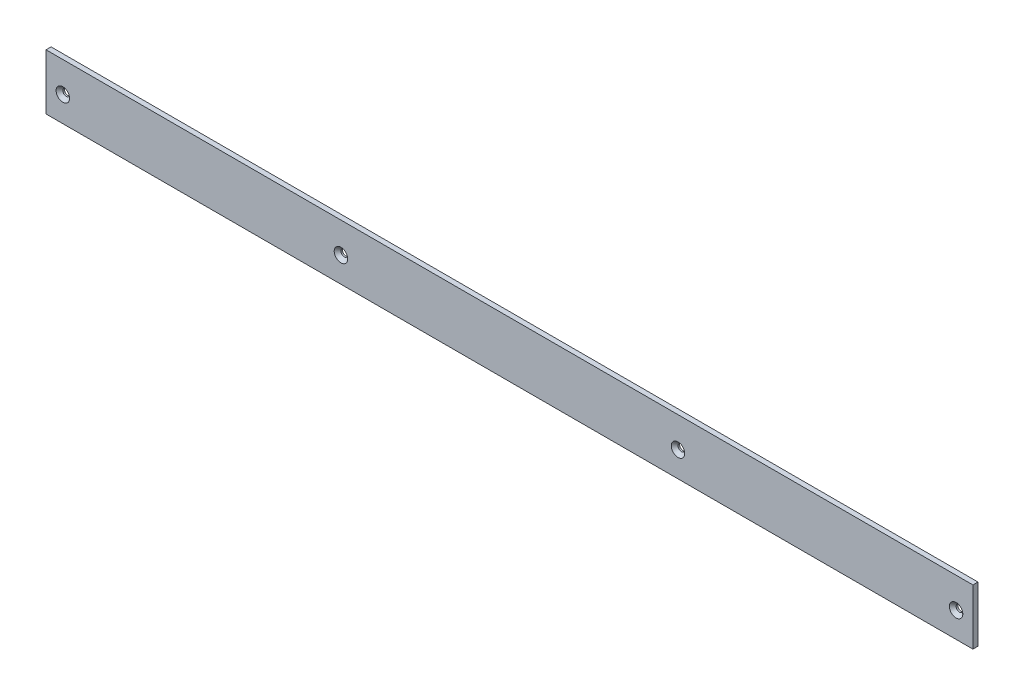
ISO-10303-21;
HEADER;
FILE_DESCRIPTION(('STEP AP214'),'2;1');
FILE_NAME('part.step','',(''),(''),'','','');
FILE_SCHEMA(('AUTOMOTIVE_DESIGN { 1 0 10303 214 1 1 1 1 }'));
ENDSEC;
DATA;
#1=APPLICATION_CONTEXT('core data for automotive mechanical design processes');
#2=APPLICATION_PROTOCOL_DEFINITION('international standard','automotive_design',2000,#1);
#3=PRODUCT_CONTEXT('',#1,'mechanical');
#4=PRODUCT('Part','Part','',(#3));
#5=PRODUCT_RELATED_PRODUCT_CATEGORY('part','',(#4));
#6=PRODUCT_DEFINITION_FORMATION('','',#4);
#7=PRODUCT_DEFINITION_CONTEXT('part definition',#1,'design');
#8=PRODUCT_DEFINITION('design','',#6,#7);
#9=PRODUCT_DEFINITION_SHAPE('','',#8);
#10=(LENGTH_UNIT() NAMED_UNIT(*) SI_UNIT(.MILLI.,.METRE.));
#11=(NAMED_UNIT(*) PLANE_ANGLE_UNIT() SI_UNIT($,.RADIAN.));
#12=(NAMED_UNIT(*) SI_UNIT($,.STERADIAN.) SOLID_ANGLE_UNIT());
#13=UNCERTAINTY_MEASURE_WITH_UNIT(LENGTH_MEASURE(1.E-05),#10,'distance_accuracy_value','');
#14=(GEOMETRIC_REPRESENTATION_CONTEXT(3) GLOBAL_UNCERTAINTY_ASSIGNED_CONTEXT((#13)) GLOBAL_UNIT_ASSIGNED_CONTEXT((#10,
#11,#12)) REPRESENTATION_CONTEXT('',''));
#15=CARTESIAN_POINT('',(0.,0.,0.));
#16=DIRECTION('',(0.,0.,1.));
#17=DIRECTION('',(1.,0.,0.));
#18=AXIS2_PLACEMENT_3D('',#15,#16,#17);
#19=CARTESIAN_POINT('',(-275.,16.5,3.));
#20=DIRECTION('',(1.,0.,0.));
#21=DIRECTION('',(0.,0.,-1.));
#22=AXIS2_PLACEMENT_3D('',#19,#20,#21);
#23=PLANE('',#22);
#24=DIRECTION('',(0.,-1.,0.));
#25=VECTOR('',#24,1.);
#26=CARTESIAN_POINT('',(-275.,16.5,0.));
#27=LINE('',#26,#25);
#28=CARTESIAN_POINT('',(-275.,16.5,0.));
#29=VERTEX_POINT('',#28);
#30=CARTESIAN_POINT('',(-275.,-16.5,0.));
#31=VERTEX_POINT('',#30);
#32=EDGE_CURVE('E106',#29,#31,#27,.T.);
#33=ORIENTED_EDGE('',*,*,#32,.T.);
#34=DIRECTION('',(0.,0.,-1.));
#35=VECTOR('',#34,1.);
#36=CARTESIAN_POINT('',(-275.,-16.5,3.));
#37=LINE('',#36,#35);
#38=CARTESIAN_POINT('',(-275.,-16.5,3.));
#39=VERTEX_POINT('',#38);
#40=EDGE_CURVE('E97',#39,#31,#37,.T.);
#41=ORIENTED_EDGE('',*,*,#40,.F.);
#42=DIRECTION('',(0.,-1.,0.));
#43=VECTOR('',#42,1.);
#44=CARTESIAN_POINT('',(-275.,16.5,3.));
#45=LINE('',#44,#43);
#46=CARTESIAN_POINT('',(-275.,16.5,3.));
#47=VERTEX_POINT('',#46);
#48=EDGE_CURVE('E91',#47,#39,#45,.T.);
#49=ORIENTED_EDGE('',*,*,#48,.F.);
#50=DIRECTION('',(0.,0.,-1.));
#51=VECTOR('',#50,1.);
#52=CARTESIAN_POINT('',(-275.,16.5,3.));
#53=LINE('',#52,#51);
#54=EDGE_CURVE('E102',#47,#29,#53,.T.);
#55=ORIENTED_EDGE('',*,*,#54,.T.);
#56=EDGE_LOOP('',(#33,#41,#49,#55));
#57=FACE_BOUND('',#56,.T.);
#58=ADVANCED_FACE('F37',(#57),#23,.F.);
#59=CARTESIAN_POINT('',(-275.,-16.5,3.));
#60=DIRECTION('',(0.,1.,0.));
#61=DIRECTION('',(0.,0.,1.));
#62=AXIS2_PLACEMENT_3D('',#59,#60,#61);
#63=PLANE('',#62);
#64=DIRECTION('',(1.,0.,0.));
#65=VECTOR('',#64,1.);
#66=CARTESIAN_POINT('',(-275.,-16.5,0.));
#67=LINE('',#66,#65);
#68=CARTESIAN_POINT('',(275.,-16.5,0.));
#69=VERTEX_POINT('',#68);
#70=EDGE_CURVE('E96',#31,#69,#67,.T.);
#71=ORIENTED_EDGE('',*,*,#70,.T.);
#72=DIRECTION('',(0.,0.,-1.));
#73=VECTOR('',#72,1.);
#74=CARTESIAN_POINT('',(275.,-16.5,3.));
#75=LINE('',#74,#73);
#76=CARTESIAN_POINT('',(275.,-16.5,3.));
#77=VERTEX_POINT('',#76);
#78=EDGE_CURVE('E94',#77,#69,#75,.T.);
#79=ORIENTED_EDGE('',*,*,#78,.F.);
#80=DIRECTION('',(1.,0.,0.));
#81=VECTOR('',#80,1.);
#82=CARTESIAN_POINT('',(-275.,-16.5,3.));
#83=LINE('',#82,#81);
#84=EDGE_CURVE('E86',#39,#77,#83,.T.);
#85=ORIENTED_EDGE('',*,*,#84,.F.);
#86=ORIENTED_EDGE('',*,*,#40,.T.);
#87=EDGE_LOOP('',(#71,#79,#85,#86));
#88=FACE_BOUND('',#87,.T.);
#89=ADVANCED_FACE('F95',(#88),#63,.F.);
#90=CARTESIAN_POINT('',(275.,16.5,3.));
#91=DIRECTION('',(-1.,0.,0.));
#92=DIRECTION('',(0.,0.,1.));
#93=AXIS2_PLACEMENT_3D('',#90,#91,#92);
#94=PLANE('',#93);
#95=DIRECTION('',(0.,1.,0.));
#96=VECTOR('',#95,1.);
#97=CARTESIAN_POINT('',(275.,16.5,0.));
#98=LINE('',#97,#96);
#99=CARTESIAN_POINT('',(275.,16.5,0.));
#100=VERTEX_POINT('',#99);
#101=EDGE_CURVE('E72',#69,#100,#98,.T.);
#102=ORIENTED_EDGE('',*,*,#101,.T.);
#103=DIRECTION('',(0.,0.,-1.));
#104=VECTOR('',#103,1.);
#105=CARTESIAN_POINT('',(275.,16.5,3.));
#106=LINE('',#105,#104);
#107=CARTESIAN_POINT('',(275.,16.5,3.));
#108=VERTEX_POINT('',#107);
#109=EDGE_CURVE('E98',#108,#100,#106,.T.);
#110=ORIENTED_EDGE('',*,*,#109,.F.);
#111=DIRECTION('',(0.,1.,0.));
#112=VECTOR('',#111,1.);
#113=CARTESIAN_POINT('',(275.,16.5,3.));
#114=LINE('',#113,#112);
#115=EDGE_CURVE('E89',#77,#108,#114,.T.);
#116=ORIENTED_EDGE('',*,*,#115,.F.);
#117=ORIENTED_EDGE('',*,*,#78,.T.);
#118=EDGE_LOOP('',(#102,#110,#116,#117));
#119=FACE_BOUND('',#118,.T.);
#120=ADVANCED_FACE('F100',(#119),#94,.F.);
#121=CARTESIAN_POINT('',(-275.,16.5,3.));
#122=DIRECTION('',(0.,-1.,0.));
#123=DIRECTION('',(0.,0.,-1.));
#124=AXIS2_PLACEMENT_3D('',#121,#122,#123);
#125=PLANE('',#124);
#126=DIRECTION('',(-1.,0.,0.));
#127=VECTOR('',#126,1.);
#128=CARTESIAN_POINT('',(-275.,16.5,0.));
#129=LINE('',#128,#127);
#130=EDGE_CURVE('E78',#100,#29,#129,.T.);
#131=ORIENTED_EDGE('',*,*,#130,.T.);
#132=ORIENTED_EDGE('',*,*,#54,.F.);
#133=DIRECTION('',(-1.,0.,0.));
#134=VECTOR('',#133,1.);
#135=CARTESIAN_POINT('',(-275.,16.5,3.));
#136=LINE('',#135,#134);
#137=EDGE_CURVE('E55',#108,#47,#136,.T.);
#138=ORIENTED_EDGE('',*,*,#137,.F.);
#139=ORIENTED_EDGE('',*,*,#109,.T.);
#140=EDGE_LOOP('',(#131,#132,#138,#139));
#141=FACE_BOUND('',#140,.T.);
#142=ADVANCED_FACE('F214',(#141),#125,.F.);
#143=CARTESIAN_POINT('',(0.,0.,3.));
#144=DIRECTION('',(0.,0.,1.));
#145=DIRECTION('',(1.,0.,0.));
#146=AXIS2_PLACEMENT_3D('',#143,#144,#145);
#147=PLANE('',#146);
#148=CARTESIAN_POINT('',(265.,-1.49999999999999,3.));
#149=DIRECTION('',(0.,0.,1.));
#150=DIRECTION('',(1.,0.,0.));
#151=AXIS2_PLACEMENT_3D('',#148,#149,#150);
#152=CIRCLE('',#151,4.);
#153=CARTESIAN_POINT('',(269.,-1.49999999999999,3.));
#154=VERTEX_POINT('',#153);
#155=EDGE_CURVE('E128',#154,#154,#152,.F.);
#156=ORIENTED_EDGE('',*,*,#155,.T.);
#157=EDGE_LOOP('',(#156));
#158=FACE_BOUND('',#157,.T.);
#159=CARTESIAN_POINT('',(100.,-1.49999999999999,3.));
#160=DIRECTION('',(0.,0.,1.));
#161=DIRECTION('',(1.,0.,0.));
#162=AXIS2_PLACEMENT_3D('',#159,#160,#161);
#163=CIRCLE('',#162,4.);
#164=CARTESIAN_POINT('',(104.,-1.49999999999999,3.));
#165=VERTEX_POINT('',#164);
#166=EDGE_CURVE('E125',#165,#165,#163,.F.);
#167=ORIENTED_EDGE('',*,*,#166,.T.);
#168=EDGE_LOOP('',(#167));
#169=FACE_BOUND('',#168,.T.);
#170=CARTESIAN_POINT('',(-100.,-1.49999999999999,3.));
#171=DIRECTION('',(0.,0.,1.));
#172=DIRECTION('',(1.,0.,0.));
#173=AXIS2_PLACEMENT_3D('',#170,#171,#172);
#174=CIRCLE('',#173,4.);
#175=CARTESIAN_POINT('',(-96.,-1.49999999999999,3.));
#176=VERTEX_POINT('',#175);
#177=EDGE_CURVE('E122',#176,#176,#174,.F.);
#178=ORIENTED_EDGE('',*,*,#177,.T.);
#179=EDGE_LOOP('',(#178));
#180=FACE_BOUND('',#179,.T.);
#181=CARTESIAN_POINT('',(-265.,-1.49999999999999,3.));
#182=DIRECTION('',(0.,0.,1.));
#183=DIRECTION('',(1.,0.,0.));
#184=AXIS2_PLACEMENT_3D('',#181,#182,#183);
#185=CIRCLE('',#184,4.);
#186=CARTESIAN_POINT('',(-261.,-1.49999999999999,3.));
#187=VERTEX_POINT('',#186);
#188=EDGE_CURVE('E119',#187,#187,#185,.F.);
#189=ORIENTED_EDGE('',*,*,#188,.T.);
#190=EDGE_LOOP('',(#189));
#191=FACE_BOUND('',#190,.T.);
#192=ORIENTED_EDGE('',*,*,#48,.T.);
#193=ORIENTED_EDGE('',*,*,#84,.T.);
#194=ORIENTED_EDGE('',*,*,#115,.T.);
#195=ORIENTED_EDGE('',*,*,#137,.T.);
#196=EDGE_LOOP('',(#192,#193,#194,#195));
#197=FACE_BOUND('',#196,.T.);
#198=ADVANCED_FACE('F87',(#158,#169,#180,#191,#197),#147,.T.);
#199=CARTESIAN_POINT('',(0.,0.,0.));
#200=DIRECTION('',(0.,0.,1.));
#201=DIRECTION('',(1.,0.,0.));
#202=AXIS2_PLACEMENT_3D('',#199,#200,#201);
#203=PLANE('',#202);
#204=CARTESIAN_POINT('',(-265.,-1.49999999999999,0.));
#205=DIRECTION('',(0.,0.,1.));
#206=DIRECTION('',(1.,0.,0.));
#207=AXIS2_PLACEMENT_3D('',#204,#205,#206);
#208=CIRCLE('',#207,2.);
#209=CARTESIAN_POINT('',(-263.,-1.49999999999999,0.));
#210=VERTEX_POINT('',#209);
#211=EDGE_CURVE('E109',#210,#210,#208,.T.);
#212=ORIENTED_EDGE('',*,*,#211,.T.);
#213=EDGE_LOOP('',(#212));
#214=FACE_BOUND('',#213,.T.);
#215=CARTESIAN_POINT('',(-100.,-1.49999999999999,0.));
#216=DIRECTION('',(0.,0.,1.));
#217=DIRECTION('',(1.,0.,0.));
#218=AXIS2_PLACEMENT_3D('',#215,#216,#217);
#219=CIRCLE('',#218,2.);
#220=CARTESIAN_POINT('',(-98.,-1.49999999999999,0.));
#221=VERTEX_POINT('',#220);
#222=EDGE_CURVE('E197',#221,#221,#219,.T.);
#223=ORIENTED_EDGE('',*,*,#222,.T.);
#224=EDGE_LOOP('',(#223));
#225=FACE_BOUND('',#224,.T.);
#226=CARTESIAN_POINT('',(100.,-1.49999999999999,0.));
#227=DIRECTION('',(0.,0.,1.));
#228=DIRECTION('',(-1.,0.,0.));
#229=AXIS2_PLACEMENT_3D('',#226,#227,#228);
#230=CIRCLE('',#229,2.);
#231=CARTESIAN_POINT('',(98.,-1.49999999999999,0.));
#232=VERTEX_POINT('',#231);
#233=EDGE_CURVE('E194',#232,#232,#230,.T.);
#234=ORIENTED_EDGE('',*,*,#233,.T.);
#235=EDGE_LOOP('',(#234));
#236=FACE_BOUND('',#235,.T.);
#237=CARTESIAN_POINT('',(265.,-1.49999999999999,0.));
#238=DIRECTION('',(0.,0.,1.));
#239=DIRECTION('',(-1.,0.,0.));
#240=AXIS2_PLACEMENT_3D('',#237,#238,#239);
#241=CIRCLE('',#240,2.);
#242=CARTESIAN_POINT('',(263.,-1.49999999999999,0.));
#243=VERTEX_POINT('',#242);
#244=EDGE_CURVE('E192',#243,#243,#241,.T.);
#245=ORIENTED_EDGE('',*,*,#244,.T.);
#246=EDGE_LOOP('',(#245));
#247=FACE_BOUND('',#246,.T.);
#248=ORIENTED_EDGE('',*,*,#32,.F.);
#249=ORIENTED_EDGE('',*,*,#130,.F.);
#250=ORIENTED_EDGE('',*,*,#101,.F.);
#251=ORIENTED_EDGE('',*,*,#70,.F.);
#252=EDGE_LOOP('',(#248,#249,#250,#251));
#253=FACE_BOUND('',#252,.T.);
#254=ADVANCED_FACE('F188',(#214,#225,#236,#247,#253),#203,.F.);
#255=CARTESIAN_POINT('',(265.,-1.49999999999999,3.));
#256=DIRECTION('',(0.,0.,-1.));
#257=DIRECTION('',(-1.,0.,0.));
#258=AXIS2_PLACEMENT_3D('',#255,#256,#257);
#259=CYLINDRICAL_SURFACE('',#258,2.);
#260=CARTESIAN_POINT('',(265.,-1.49999999999999,1.00000000000004));
#261=DIRECTION('',(0.,0.,1.));
#262=DIRECTION('',(1.,0.,0.));
#263=AXIS2_PLACEMENT_3D('',#260,#261,#262);
#264=CIRCLE('',#263,2.);
#265=CARTESIAN_POINT('',(267.,-1.49999999999999,1.00000000000004));
#266=VERTEX_POINT('',#265);
#267=EDGE_CURVE('E116',#266,#266,#264,.T.);
#268=ORIENTED_EDGE('',*,*,#267,.T.);
#269=EDGE_LOOP('',(#268));
#270=FACE_BOUND('',#269,.T.);
#271=ORIENTED_EDGE('',*,*,#244,.F.);
#272=EDGE_LOOP('',(#271));
#273=FACE_BOUND('',#272,.T.);
#274=ADVANCED_FACE('F184',(#270,#273),#259,.F.);
#275=CARTESIAN_POINT('',(100.,-1.49999999999999,3.));
#276=DIRECTION('',(0.,0.,-1.));
#277=DIRECTION('',(-1.,0.,0.));
#278=AXIS2_PLACEMENT_3D('',#275,#276,#277);
#279=CYLINDRICAL_SURFACE('',#278,2.);
#280=CARTESIAN_POINT('',(100.,-1.49999999999999,1.00000000000004));
#281=DIRECTION('',(0.,0.,1.));
#282=DIRECTION('',(1.,0.,0.));
#283=AXIS2_PLACEMENT_3D('',#280,#281,#282);
#284=CIRCLE('',#283,2.);
#285=CARTESIAN_POINT('',(102.,-1.49999999999999,1.00000000000004));
#286=VERTEX_POINT('',#285);
#287=EDGE_CURVE('E131',#286,#286,#284,.T.);
#288=ORIENTED_EDGE('',*,*,#287,.T.);
#289=EDGE_LOOP('',(#288));
#290=FACE_BOUND('',#289,.T.);
#291=ORIENTED_EDGE('',*,*,#233,.F.);
#292=EDGE_LOOP('',(#291));
#293=FACE_BOUND('',#292,.T.);
#294=ADVANCED_FACE('F187',(#290,#293),#279,.F.);
#295=CARTESIAN_POINT('',(-100.,-1.49999999999999,3.));
#296=DIRECTION('',(0.,0.,-1.));
#297=DIRECTION('',(-1.,0.,0.));
#298=AXIS2_PLACEMENT_3D('',#295,#296,#297);
#299=CYLINDRICAL_SURFACE('',#298,2.);
#300=CARTESIAN_POINT('',(-100.,-1.49999999999999,1.00000000000004));
#301=DIRECTION('',(0.,0.,1.));
#302=DIRECTION('',(1.,0.,0.));
#303=AXIS2_PLACEMENT_3D('',#300,#301,#302);
#304=CIRCLE('',#303,2.);
#305=CARTESIAN_POINT('',(-98.,-1.49999999999999,1.00000000000004));
#306=VERTEX_POINT('',#305);
#307=EDGE_CURVE('E47',#306,#306,#304,.T.);
#308=ORIENTED_EDGE('',*,*,#307,.T.);
#309=EDGE_LOOP('',(#308));
#310=FACE_BOUND('',#309,.T.);
#311=ORIENTED_EDGE('',*,*,#222,.F.);
#312=EDGE_LOOP('',(#311));
#313=FACE_BOUND('',#312,.T.);
#314=ADVANCED_FACE('F136',(#310,#313),#299,.F.);
#315=CARTESIAN_POINT('',(-265.,-1.49999999999999,3.));
#316=DIRECTION('',(0.,0.,-1.));
#317=DIRECTION('',(-1.,0.,0.));
#318=AXIS2_PLACEMENT_3D('',#315,#316,#317);
#319=CYLINDRICAL_SURFACE('',#318,2.);
#320=CARTESIAN_POINT('',(-265.,-1.49999999999999,1.00000000000004));
#321=DIRECTION('',(0.,0.,1.));
#322=DIRECTION('',(1.,0.,0.));
#323=AXIS2_PLACEMENT_3D('',#320,#321,#322);
#324=CIRCLE('',#323,2.);
#325=CARTESIAN_POINT('',(-263.,-1.49999999999999,1.00000000000004));
#326=VERTEX_POINT('',#325);
#327=EDGE_CURVE('E11',#326,#326,#324,.T.);
#328=ORIENTED_EDGE('',*,*,#327,.T.);
#329=EDGE_LOOP('',(#328));
#330=FACE_BOUND('',#329,.T.);
#331=ORIENTED_EDGE('',*,*,#211,.F.);
#332=EDGE_LOOP('',(#331));
#333=FACE_BOUND('',#332,.T.);
#334=ADVANCED_FACE('F167',(#330,#333),#319,.F.);
#335=CARTESIAN_POINT('',(265.,-1.49999999999999,1.00000000000004));
#336=DIRECTION('',(0.,0.,1.));
#337=DIRECTION('',(1.,0.,0.));
#338=AXIS2_PLACEMENT_3D('',#335,#336,#337);
#339=CONICAL_SURFACE('',#338,2.,0.78539816339746);
#340=ORIENTED_EDGE('',*,*,#155,.F.);
#341=EDGE_LOOP('',(#340));
#342=FACE_BOUND('',#341,.T.);
#343=ORIENTED_EDGE('',*,*,#267,.F.);
#344=EDGE_LOOP('',(#343));
#345=FACE_BOUND('',#344,.T.);
#346=ADVANCED_FACE('F148',(#342,#345),#339,.F.);
#347=CARTESIAN_POINT('',(100.,-1.49999999999999,1.00000000000004));
#348=DIRECTION('',(0.,0.,1.));
#349=DIRECTION('',(1.,0.,0.));
#350=AXIS2_PLACEMENT_3D('',#347,#348,#349);
#351=CONICAL_SURFACE('',#350,2.,0.78539816339746);
#352=ORIENTED_EDGE('',*,*,#166,.F.);
#353=EDGE_LOOP('',(#352));
#354=FACE_BOUND('',#353,.T.);
#355=ORIENTED_EDGE('',*,*,#287,.F.);
#356=EDGE_LOOP('',(#355));
#357=FACE_BOUND('',#356,.T.);
#358=ADVANCED_FACE('F141',(#354,#357),#351,.F.);
#359=CARTESIAN_POINT('',(-100.,-1.49999999999999,1.00000000000004));
#360=DIRECTION('',(0.,0.,1.));
#361=DIRECTION('',(1.,0.,0.));
#362=AXIS2_PLACEMENT_3D('',#359,#360,#361);
#363=CONICAL_SURFACE('',#362,2.,0.78539816339746);
#364=ORIENTED_EDGE('',*,*,#177,.F.);
#365=EDGE_LOOP('',(#364));
#366=FACE_BOUND('',#365,.T.);
#367=ORIENTED_EDGE('',*,*,#307,.F.);
#368=EDGE_LOOP('',(#367));
#369=FACE_BOUND('',#368,.T.);
#370=ADVANCED_FACE('F139',(#366,#369),#363,.F.);
#371=CARTESIAN_POINT('',(-265.,-1.49999999999999,1.00000000000004));
#372=DIRECTION('',(0.,0.,1.));
#373=DIRECTION('',(1.,0.,0.));
#374=AXIS2_PLACEMENT_3D('',#371,#372,#373);
#375=CONICAL_SURFACE('',#374,2.,0.78539816339746);
#376=ORIENTED_EDGE('',*,*,#188,.F.);
#377=EDGE_LOOP('',(#376));
#378=FACE_BOUND('',#377,.T.);
#379=ORIENTED_EDGE('',*,*,#327,.F.);
#380=EDGE_LOOP('',(#379));
#381=FACE_BOUND('',#380,.T.);
#382=ADVANCED_FACE('F40',(#378,#381),#375,.F.);
#383=CLOSED_SHELL('',(#58,#89,#120,#142,#198,#254,#274,#294,#314,#334,#346,#358,#370,#382));
#384=MANIFOLD_SOLID_BREP('B2',#383);
#385=ADVANCED_BREP_SHAPE_REPRESENTATION('',(#18,#384),#14);
#386=SHAPE_DEFINITION_REPRESENTATION(#9,#385);
ENDSEC;
END-ISO-10303-21;
